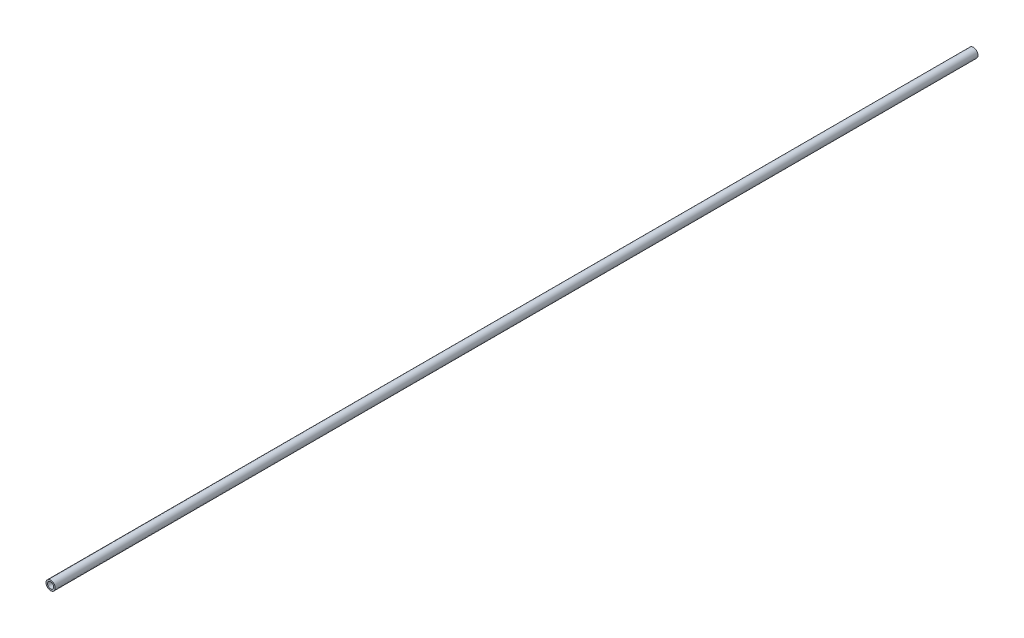
ISO-10303-21;
HEADER;
FILE_DESCRIPTION(('STEP AP214'),'2;1');
FILE_NAME('part.step','',(''),(''),'','','');
FILE_SCHEMA(('AUTOMOTIVE_DESIGN { 1 0 10303 214 1 1 1 1 }'));
ENDSEC;
DATA;
#1=APPLICATION_CONTEXT('core data for automotive mechanical design processes');
#2=APPLICATION_PROTOCOL_DEFINITION('international standard','automotive_design',2000,#1);
#3=PRODUCT_CONTEXT('',#1,'mechanical');
#4=PRODUCT('Part','Part','',(#3));
#5=PRODUCT_RELATED_PRODUCT_CATEGORY('part','',(#4));
#6=PRODUCT_DEFINITION_FORMATION('','',#4);
#7=PRODUCT_DEFINITION_CONTEXT('part definition',#1,'design');
#8=PRODUCT_DEFINITION('design','',#6,#7);
#9=PRODUCT_DEFINITION_SHAPE('','',#8);
#10=(LENGTH_UNIT() NAMED_UNIT(*) SI_UNIT(.MILLI.,.METRE.));
#11=(NAMED_UNIT(*) PLANE_ANGLE_UNIT() SI_UNIT($,.RADIAN.));
#12=(NAMED_UNIT(*) SI_UNIT($,.STERADIAN.) SOLID_ANGLE_UNIT());
#13=UNCERTAINTY_MEASURE_WITH_UNIT(LENGTH_MEASURE(1.E-05),#10,'distance_accuracy_value','');
#14=(GEOMETRIC_REPRESENTATION_CONTEXT(3) GLOBAL_UNCERTAINTY_ASSIGNED_CONTEXT((#13)) GLOBAL_UNIT_ASSIGNED_CONTEXT((#10,
#11,#12)) REPRESENTATION_CONTEXT('',''));
#15=CARTESIAN_POINT('',(0.,0.,0.));
#16=DIRECTION('',(0.,0.,1.));
#17=DIRECTION('',(1.,0.,0.));
#18=AXIS2_PLACEMENT_3D('',#15,#16,#17);
#19=CARTESIAN_POINT('',(0.,0.,600.));
#20=DIRECTION('',(0.,0.,1.));
#21=DIRECTION('',(1.,0.,0.));
#22=AXIS2_PLACEMENT_3D('',#19,#20,#21);
#23=PLANE('',#22);
#24=CARTESIAN_POINT('',(0.,0.,600.));
#25=DIRECTION('',(0.,0.,1.));
#26=DIRECTION('',(1.,0.,0.));
#27=AXIS2_PLACEMENT_3D('',#24,#25,#26);
#28=CIRCLE('',#27,3.);
#29=CARTESIAN_POINT('',(3.,0.,600.));
#30=VERTEX_POINT('',#29);
#31=EDGE_CURVE('E10',#30,#30,#28,.T.);
#32=ORIENTED_EDGE('',*,*,#31,.T.);
#33=EDGE_LOOP('',(#32));
#34=FACE_BOUND('',#33,.T.);
#35=CARTESIAN_POINT('',(0.,0.,600.));
#36=DIRECTION('',(0.,0.,1.));
#37=DIRECTION('',(1.,0.,0.));
#38=AXIS2_PLACEMENT_3D('',#35,#36,#37);
#39=CIRCLE('',#38,2.);
#40=CARTESIAN_POINT('',(2.,0.,600.));
#41=VERTEX_POINT('',#40);
#42=EDGE_CURVE('E41',#41,#41,#39,.T.);
#43=ORIENTED_EDGE('',*,*,#42,.F.);
#44=EDGE_LOOP('',(#43));
#45=FACE_BOUND('',#44,.T.);
#46=ADVANCED_FACE('F30',(#34,#45),#23,.T.);
#47=CARTESIAN_POINT('',(0.,0.,0.));
#48=DIRECTION('',(0.,0.,1.));
#49=DIRECTION('',(1.,0.,0.));
#50=AXIS2_PLACEMENT_3D('',#47,#48,#49);
#51=PLANE('',#50);
#52=CARTESIAN_POINT('',(0.,0.,0.));
#53=DIRECTION('',(0.,0.,1.));
#54=DIRECTION('',(1.,0.,0.));
#55=AXIS2_PLACEMENT_3D('',#52,#53,#54);
#56=CIRCLE('',#55,3.);
#57=CARTESIAN_POINT('',(3.,0.,0.));
#58=VERTEX_POINT('',#57);
#59=EDGE_CURVE('E34',#58,#58,#56,.T.);
#60=ORIENTED_EDGE('',*,*,#59,.F.);
#61=EDGE_LOOP('',(#60));
#62=FACE_BOUND('',#61,.T.);
#63=CARTESIAN_POINT('',(0.,0.,0.));
#64=DIRECTION('',(0.,0.,1.));
#65=DIRECTION('',(1.,0.,0.));
#66=AXIS2_PLACEMENT_3D('',#63,#64,#65);
#67=CIRCLE('',#66,2.);
#68=CARTESIAN_POINT('',(2.,0.,0.));
#69=VERTEX_POINT('',#68);
#70=EDGE_CURVE('E43',#69,#69,#67,.T.);
#71=ORIENTED_EDGE('',*,*,#70,.T.);
#72=EDGE_LOOP('',(#71));
#73=FACE_BOUND('',#72,.T.);
#74=ADVANCED_FACE('F53',(#62,#73),#51,.F.);
#75=CARTESIAN_POINT('',(0.,0.,600.));
#76=DIRECTION('',(0.,0.,-1.));
#77=DIRECTION('',(-1.,0.,0.));
#78=AXIS2_PLACEMENT_3D('',#75,#76,#77);
#79=CYLINDRICAL_SURFACE('',#78,3.);
#80=ORIENTED_EDGE('',*,*,#31,.F.);
#81=EDGE_LOOP('',(#80));
#82=FACE_BOUND('',#81,.T.);
#83=ORIENTED_EDGE('',*,*,#59,.T.);
#84=EDGE_LOOP('',(#83));
#85=FACE_BOUND('',#84,.T.);
#86=ADVANCED_FACE('F32',(#82,#85),#79,.T.);
#87=CARTESIAN_POINT('',(0.,0.,600.));
#88=DIRECTION('',(0.,0.,-1.));
#89=DIRECTION('',(-1.,0.,0.));
#90=AXIS2_PLACEMENT_3D('',#87,#88,#89);
#91=CYLINDRICAL_SURFACE('',#90,2.);
#92=ORIENTED_EDGE('',*,*,#42,.T.);
#93=EDGE_LOOP('',(#92));
#94=FACE_BOUND('',#93,.T.);
#95=ORIENTED_EDGE('',*,*,#70,.F.);
#96=EDGE_LOOP('',(#95));
#97=FACE_BOUND('',#96,.T.);
#98=ADVANCED_FACE('F49',(#94,#97),#91,.F.);
#99=CLOSED_SHELL('',(#46,#74,#86,#98));
#100=MANIFOLD_SOLID_BREP('B2',#99);
#101=ADVANCED_BREP_SHAPE_REPRESENTATION('',(#18,#100),#14);
#102=SHAPE_DEFINITION_REPRESENTATION(#9,#101);
ENDSEC;
END-ISO-10303-21;
